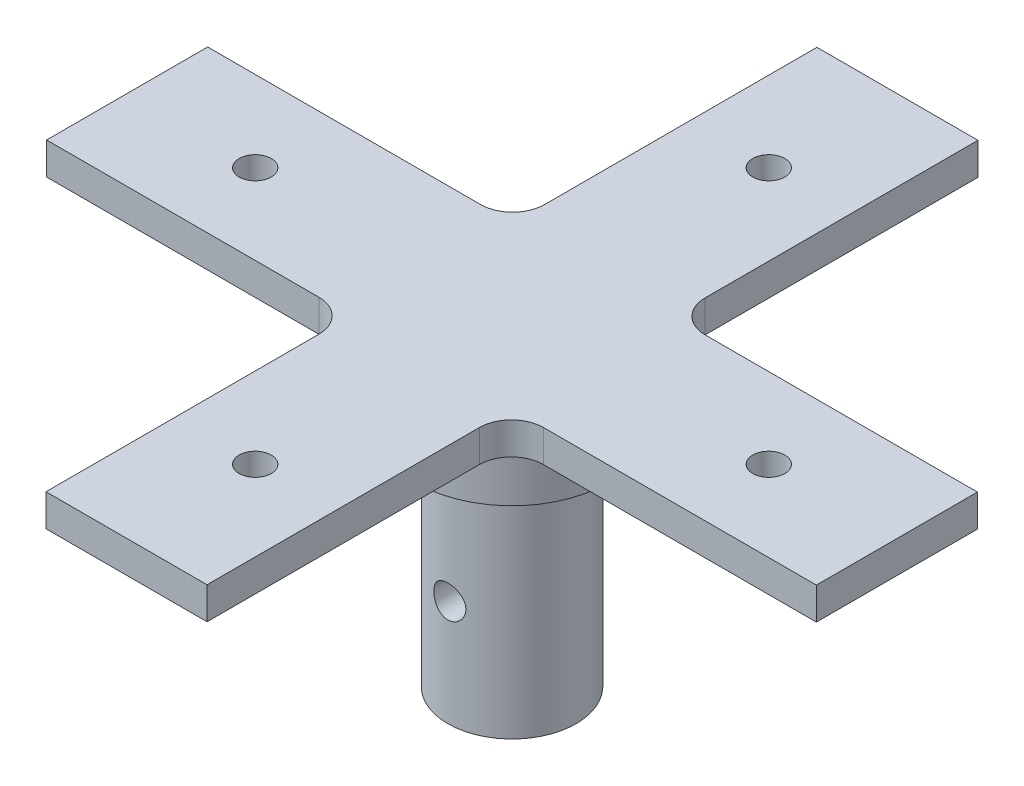
ISO-10303-21;
HEADER;
FILE_DESCRIPTION(('STEP AP214'),'2;1');
FILE_NAME('part.step','',(''),(''),'','','');
FILE_SCHEMA(('AUTOMOTIVE_DESIGN { 1 0 10303 214 1 1 1 1 }'));
ENDSEC;
DATA;
#1=APPLICATION_CONTEXT('core data for automotive mechanical design processes');
#2=APPLICATION_PROTOCOL_DEFINITION('international standard','automotive_design',2000,#1);
#3=PRODUCT_CONTEXT('',#1,'mechanical');
#4=PRODUCT('Part','Part','',(#3));
#5=PRODUCT_RELATED_PRODUCT_CATEGORY('part','',(#4));
#6=PRODUCT_DEFINITION_FORMATION('','',#4);
#7=PRODUCT_DEFINITION_CONTEXT('part definition',#1,'design');
#8=PRODUCT_DEFINITION('design','',#6,#7);
#9=PRODUCT_DEFINITION_SHAPE('','',#8);
#10=(LENGTH_UNIT() NAMED_UNIT(*) SI_UNIT(.MILLI.,.METRE.));
#11=(NAMED_UNIT(*) PLANE_ANGLE_UNIT() SI_UNIT($,.RADIAN.));
#12=(NAMED_UNIT(*) SI_UNIT($,.STERADIAN.) SOLID_ANGLE_UNIT());
#13=UNCERTAINTY_MEASURE_WITH_UNIT(LENGTH_MEASURE(1.E-05),#10,'distance_accuracy_value','');
#14=(GEOMETRIC_REPRESENTATION_CONTEXT(3) GLOBAL_UNCERTAINTY_ASSIGNED_CONTEXT((#13)) GLOBAL_UNIT_ASSIGNED_CONTEXT((#10,
#11,#12)) REPRESENTATION_CONTEXT('',''));
#15=CARTESIAN_POINT('',(0.,0.,0.));
#16=DIRECTION('',(0.,0.,1.));
#17=DIRECTION('',(1.,0.,0.));
#18=AXIS2_PLACEMENT_3D('',#15,#16,#17);
#19=CARTESIAN_POINT('',(0.,35.,0.));
#20=DIRECTION('',(0.,-1.,0.));
#21=DIRECTION('',(0.,0.,-1.));
#22=AXIS2_PLACEMENT_3D('',#19,#20,#21);
#23=CYLINDRICAL_SURFACE('',#22,10.);
#24=CARTESIAN_POINT('',(0.,19.,-10.));
#25=CARTESIAN_POINT('',(-0.138126814449552,18.9999961237697,-9.99999766446687));
#26=CARTESIAN_POINT('',(-0.276296929717938,18.9885140820437,-9.99710963553044));
#27=CARTESIAN_POINT('',(-0.548677206284221,18.942958081155,-9.98586856383157));
#28=CARTESIAN_POINT('',(-0.682885078117899,18.9088713174369,-9.97751242366627));
#29=CARTESIAN_POINT('',(-0.943368120304295,18.8192679108965,-9.9562604388672));
#30=CARTESIAN_POINT('',(-1.06965260571667,18.7637770021412,-9.94337004736764));
#31=CARTESIAN_POINT('',(-1.31112021984071,18.6330310165919,-9.91442239679369));
#32=CARTESIAN_POINT('',(-1.42630297391461,18.5577752731351,-9.89836503090261));
#33=CARTESIAN_POINT('',(-1.64466987883486,18.3879986839097,-9.86445689319489));
#34=CARTESIAN_POINT('',(-1.74759281676843,18.2931473750682,-9.84657845246877));
#35=CARTESIAN_POINT('',(-1.93624821200553,18.0875796584849,-9.8112270019656));
#36=CARTESIAN_POINT('',(-2.02197872824865,17.9768614617551,-9.79375403816446));
#37=CARTESIAN_POINT('',(-2.17504423799829,17.740674622105,-9.76091292830281));
#38=CARTESIAN_POINT('',(-2.2420870265419,17.6150112819855,-9.74557990774685));
#39=CARTESIAN_POINT('',(-2.35399484758457,17.3537526472333,-9.71915824696694));
#40=CARTESIAN_POINT('',(-2.39886342573357,17.2181589444466,-9.70806892824031));
#41=CARTESIAN_POINT('',(-2.46425806134127,16.9437608363306,-9.69167461160538));
#42=CARTESIAN_POINT('',(-2.48525378055342,16.80507517327,-9.68625818328352));
#43=CARTESIAN_POINT('',(-2.50376962511068,16.5260523850011,-9.68148937432652));
#44=CARTESIAN_POINT('',(-2.50129356969685,16.3857155321798,-9.68213600713215));
#45=CARTESIAN_POINT('',(-2.47331087439951,16.1109736537577,-9.68932009194695));
#46=CARTESIAN_POINT('',(-2.44836390031772,15.9765072975578,-9.6957143834549));
#47=CARTESIAN_POINT('',(-2.37704031150498,15.7137315818149,-9.71344516118448));
#48=CARTESIAN_POINT('',(-2.33066217011565,15.5854226616185,-9.72478199948731));
#49=CARTESIAN_POINT('',(-2.21731579656197,15.3371033062465,-9.75125189842765));
#50=CARTESIAN_POINT('',(-2.1501444453882,15.2171897136841,-9.76642212449694));
#51=CARTESIAN_POINT('',(-1.99726046002491,14.9901354837386,-9.79882851409985));
#52=CARTESIAN_POINT('',(-1.91154458134806,14.8829970865546,-9.81606503891047));
#53=CARTESIAN_POINT('',(-1.72110570780203,14.681327307176,-9.85126467566485));
#54=CARTESIAN_POINT('',(-1.61591043027643,14.5872425165644,-9.86923449130002));
#55=CARTESIAN_POINT('',(-1.39101986250616,14.4179645958935,-9.90343275964594));
#56=CARTESIAN_POINT('',(-1.27132412951323,14.3427720428941,-9.91966115915679));
#57=CARTESIAN_POINT('',(-1.02019314780231,14.2132490229594,-9.94862886823651));
#58=CARTESIAN_POINT('',(-0.888718988681034,14.158991099576,-9.96135600212879));
#59=CARTESIAN_POINT('',(-0.618126680238133,14.0734711571507,-9.98179861652361));
#60=CARTESIAN_POINT('',(-0.479009998584136,14.0422047393031,-9.98951505565468));
#61=CARTESIAN_POINT('',(-0.20089995065004,14.0042373907353,-9.99892498785624));
#62=CARTESIAN_POINT('',(-0.061994533313678,13.9969282898745,-10.0007675584713));
#63=CARTESIAN_POINT('',(0.215054791335853,14.0054150034258,-9.99864674690754));
#64=CARTESIAN_POINT('',(0.353198766074332,14.0212087379986,-9.99468388736421));
#65=CARTESIAN_POINT('',(0.622690447960822,14.0749515139856,-9.98149301878918));
#66=CARTESIAN_POINT('',(0.754108531614588,14.1125687724616,-9.97234390309647));
#67=CARTESIAN_POINT('',(1.00876215408753,14.2085118067141,-9.94981177723595));
#68=CARTESIAN_POINT('',(1.13199686505442,14.2668396738554,-9.93642833949965));
#69=CARTESIAN_POINT('',(1.36920522404972,14.4037268814578,-9.9065551321037));
#70=CARTESIAN_POINT('',(1.48297573639295,14.4826268539943,-9.89001445610999));
#71=CARTESIAN_POINT('',(1.69587768940552,14.6579831813286,-9.85574181979587));
#72=CARTESIAN_POINT('',(1.79500659828875,14.7544425660294,-9.83800965421578));
#73=CARTESIAN_POINT('',(1.97831761345414,14.9650032680729,-9.80281594932498));
#74=CARTESIAN_POINT('',(2.06207311270184,15.0794795049993,-9.78537173637463));
#75=CARTESIAN_POINT('',(2.20918459835605,15.3212210574476,-9.75321463970069));
#76=CARTESIAN_POINT('',(2.27254149026901,15.4484858049507,-9.73850163474941));
#77=CARTESIAN_POINT('',(2.37658570101224,15.7115095373437,-9.71363491194665));
#78=CARTESIAN_POINT('',(2.41740732773931,15.8472127138538,-9.70345425375809));
#79=CARTESIAN_POINT('',(2.47557609990489,16.1238493964255,-9.68877906706585));
#80=CARTESIAN_POINT('',(2.49292837912652,16.2647817517024,-9.68428329504044));
#81=CARTESIAN_POINT('',(2.50339765056083,16.5435350397694,-9.68158168701612));
#82=CARTESIAN_POINT('',(2.49719649630132,16.6813290585441,-9.68319887888034));
#83=CARTESIAN_POINT('',(2.46229546385366,16.9538398144438,-9.69213181672143));
#84=CARTESIAN_POINT('',(2.43359603781098,17.0885566133553,-9.69944744817732));
#85=CARTESIAN_POINT('',(2.35488553240495,17.3503474317764,-9.71885434473222));
#86=CARTESIAN_POINT('',(2.30500234113404,17.4774621754006,-9.73091692061057));
#87=CARTESIAN_POINT('',(2.18544152267504,17.7216089711893,-9.7584625954084));
#88=CARTESIAN_POINT('',(2.11576115005696,17.8386396219781,-9.77394616867808));
#89=CARTESIAN_POINT('',(1.95644624772859,18.0625910483368,-9.80709390439337));
#90=CARTESIAN_POINT('',(1.86633860485377,18.1691684557066,-9.82480441386302));
#91=CARTESIAN_POINT('',(1.66964895198289,18.3659117413257,-9.86013378743769));
#92=CARTESIAN_POINT('',(1.56306303543524,18.4560737168549,-9.87775262878422));
#93=CARTESIAN_POINT('',(1.33411264450432,18.6190188476077,-9.9112942607945));
#94=CARTESIAN_POINT('',(1.21149737052731,18.6914576894526,-9.92718055609783));
#95=CARTESIAN_POINT('',(0.955443432517459,18.8145791049009,-9.95508208291861));
#96=CARTESIAN_POINT('',(0.822012605727897,18.8652772677476,-9.96710008666301));
#97=CARTESIAN_POINT('',(0.574017088739116,18.9359530505494,-9.98413432609236));
#98=CARTESIAN_POINT('',(0.460633618180111,18.9599187384224,-9.99004308421151));
#99=CARTESIAN_POINT('',(0.231510119227137,18.9919432393699,-9.9979767538658));
#100=CARTESIAN_POINT('',(0.115770268737693,19.0000032488422,-10.0000019575149));
#101=CARTESIAN_POINT('',(0.,19.,-10.));
#102=B_SPLINE_CURVE_WITH_KNOTS('',3,(#24,#25,#26,#27,#28,#29,#30,#31,#32,#33,#34,#35,#36,#37,
#38,#39,#40,#41,#42,#43,#44,#45,#46,#47,#48,#49,#50,#51,#52,#53,#54,#55,#56,#57,#58,#59,#60,#61,
#62,#63,#64,#65,#66,#67,#68,#69,#70,#71,#72,#73,#74,#75,#76,#77,#78,#79,#80,#81,#82,#83,#84,#85,
#86,#87,#88,#89,#90,#91,#92,#93,#94,#95,#96,#97,#98,#99,#100,#101),.UNSPECIFIED.,.T.,.F.,(4,2,2,
2,2,2,2,2,2,2,2,2,2,2,2,2,2,2,2,2,2,2,2,2,2,2,2,2,2,2,2,2,2,2,2,2,2,2,4),(0.,0.41395618745315,
0.828147062939832,1.24184150381018,1.65554990028221,2.07690725728565,2.4983121596677,
2.92597745909678,3.35357435282281,3.77260491835117,4.19156730193363,4.60037495017232,
5.00921172448932,5.42217546462,5.83521151399139,6.26002501620567,6.6848514926928,
7.11113715020725,7.53734122819939,7.95263848254328,8.36789835193439,8.7770045752893,
9.18615212209352,9.60255979281121,10.0190393835223,10.4457418201299,10.8724253125471,
11.2965375769764,11.7205570543048,12.1323963400749,12.5442273493652,12.9536066760888,
13.3630428023797,13.7831596069298,14.2033761629383,14.6312030917578,15.0587227304538,
15.4057040491338,15.752659267482),.UNSPECIFIED.);
#103=CARTESIAN_POINT('',(0.,19.,-10.));
#104=VERTEX_POINT('',#103);
#105=EDGE_CURVE('E37',#104,#104,#102,.T.);
#106=ORIENTED_EDGE('',*,*,#105,.T.);
#107=EDGE_LOOP('',(#106));
#108=FACE_BOUND('',#107,.T.);
#109=CARTESIAN_POINT('',(2.5,16.5,9.68245836551854));
#110=CARTESIAN_POINT('',(2.49999607859307,16.3619492490734,9.6824610008786));
#111=CARTESIAN_POINT('',(2.48852624549765,16.2238551013215,9.68544306014597));
#112=CARTESIAN_POINT('',(2.44302312546379,15.9516324218265,9.69701861992564));
#113=CARTESIAN_POINT('',(2.40897670674211,15.8175062455318,9.7056153862163));
#114=CARTESIAN_POINT('',(2.31949119963204,15.5571964618128,9.7273872459615));
#115=CARTESIAN_POINT('',(2.26407972785449,15.4310028446143,9.74055642690458));
#116=CARTESIAN_POINT('',(2.13352114126138,15.1896891474601,9.76998192028759));
#117=CARTESIAN_POINT('',(2.05837318856069,15.0745695379198,9.78623836378489));
#118=CARTESIAN_POINT('',(1.88870842731188,14.8561383547378,9.82040716355625));
#119=CARTESIAN_POINT('',(1.79383688770405,14.75310639965,9.83834597623034));
#120=CARTESIAN_POINT('',(1.58818206410066,14.5642386056397,9.87362875515294));
#121=CARTESIAN_POINT('',(1.47739729418031,14.4784043743783,9.89097266566388));
#122=CARTESIAN_POINT('',(1.24114520107896,14.3252245323687,9.92340415520582));
#123=CARTESIAN_POINT('',(1.11549457619512,14.2581536118385,9.93845687400592));
#124=CARTESIAN_POINT('',(0.854263184292764,14.1461903558469,9.96430811925984));
#125=CARTESIAN_POINT('',(0.718683885791942,14.1012947480845,9.97510727334345));
#126=CARTESIAN_POINT('',(0.444358758754164,14.0358521654214,9.9910475884818));
#127=CARTESIAN_POINT('',(0.305732719548978,14.0148303556734,9.99629893844314));
#128=CARTESIAN_POINT('',(0.0268288192627715,13.9962416207245,10.000935941073));
#129=CARTESIAN_POINT('',(-0.113448794538066,13.9986712277904,10.000322460967));
#130=CARTESIAN_POINT('',(-0.388380617930966,14.0265748502501,9.99338094953534));
#131=CARTESIAN_POINT('',(-0.523090539002665,14.0515363250539,9.98718002340871));
#132=CARTESIAN_POINT('',(-0.786345618534213,14.1229712700485,9.96990836524857));
#133=CARTESIAN_POINT('',(-0.914890448426093,14.1694458853774,9.95883737398452));
#134=CARTESIAN_POINT('',(-1.16351675875451,14.2830025706871,9.93287509700884));
#135=CARTESIAN_POINT('',(-1.28351127441626,14.3502670446617,9.91795019695011));
#136=CARTESIAN_POINT('',(-1.51068905585122,14.5033556791163,9.88589903809692));
#137=CARTESIAN_POINT('',(-1.61787008771376,14.5891830685606,9.8687723965265));
#138=CARTESIAN_POINT('',(-1.81943508771239,14.7797087419824,9.83363713769356));
#139=CARTESIAN_POINT('',(-1.91339419768799,14.8848548923477,9.81561719525297));
#140=CARTESIAN_POINT('',(-2.08244093990755,15.1095999735403,9.78115043517327));
#141=CARTESIAN_POINT('',(-2.15752769011507,15.2291995794911,9.76470369108289));
#142=CARTESIAN_POINT('',(-2.28697032255646,15.4802900341489,9.73520496829319));
#143=CARTESIAN_POINT('',(-2.34122391742612,15.6118357303128,9.72216983717007));
#144=CARTESIAN_POINT('',(-2.42671405159095,15.8825854680768,9.70118640148669));
#145=CARTESIAN_POINT('',(-2.45795551638266,16.0217878639846,9.69323700842732));
#146=CARTESIAN_POINT('',(-2.49582963866592,16.2999595015299,9.68355356007457));
#147=CARTESIAN_POINT('',(-2.50309047391912,16.438837793341,9.68166088976934));
#148=CARTESIAN_POINT('',(-2.49451699051516,16.7158219365853,9.68387343364692));
#149=CARTESIAN_POINT('',(-2.4786847978498,16.8539278579494,9.687978095703));
#150=CARTESIAN_POINT('',(-2.42492546393825,17.1231142649486,9.7015708198498));
#151=CARTESIAN_POINT('',(-2.3873640682819,17.2542727265692,9.71096970242532));
#152=CARTESIAN_POINT('',(-2.29161808167046,17.5084314578533,9.73400718262805));
#153=CARTESIAN_POINT('',(-2.2334310477125,17.6314307590558,9.74764628246408));
#154=CARTESIAN_POINT('',(-2.0967706679366,17.8684412778669,9.77796137095511));
#155=CARTESIAN_POINT('',(-2.01792175383564,17.982228840043,9.79469168607245));
#156=CARTESIAN_POINT('',(-1.84265073233613,18.1951883628015,9.82917083071113));
#157=CARTESIAN_POINT('',(-1.74622573701359,18.2943579166501,9.84691982728307));
#158=CARTESIAN_POINT('',(-1.53565680246182,18.4778110425709,9.88197403031774));
#159=CARTESIAN_POINT('',(-1.42112988132898,18.5616600625488,9.8992570206188));
#160=CARTESIAN_POINT('',(-1.17925670673669,18.7089358669513,9.93097216613689));
#161=CARTESIAN_POINT('',(-1.05191112239397,18.7723637166082,9.94540447003949));
#162=CARTESIAN_POINT('',(-0.788895504327724,18.8764460345279,9.96970115738325));
#163=CARTESIAN_POINT('',(-0.653293452569703,18.9172642843791,9.97959830022409));
#164=CARTESIAN_POINT('',(-0.376874400797016,18.9754603346084,9.99385293395789));
#165=CARTESIAN_POINT('',(-0.236058412603099,18.992842658739,9.99821149393422));
#166=CARTESIAN_POINT('',(0.0427088161083098,19.0034189739388,10.0008542352202));
#167=CARTESIAN_POINT('',(0.180634567415056,18.9972542727385,9.99929947199971));
#168=CARTESIAN_POINT('',(0.453418741036879,18.9623804317641,9.99064741143608));
#169=CARTESIAN_POINT('',(0.588277254452324,18.9336719624671,9.98355027892922));
#170=CARTESIAN_POINT('',(0.850427589111937,18.8548694505729,9.96463582134723));
#171=CARTESIAN_POINT('',(0.977756236452158,18.8048913667141,9.95284411255981));
#172=CARTESIAN_POINT('',(1.22229263260406,18.6850735524511,9.92578222284145));
#173=CARTESIAN_POINT('',(1.33949910316409,18.6152313183238,9.91051160346894));
#174=CARTESIAN_POINT('',(1.56350482105826,18.4557119150097,9.87768124200718));
#175=CARTESIAN_POINT('',(1.66998747074584,18.3655996427404,9.86007542354161));
#176=CARTESIAN_POINT('',(1.86653755068376,18.1689428700566,9.82476622642974));
#177=CARTESIAN_POINT('',(1.95660081269148,18.0623942097221,9.80706282418256));
#178=CARTESIAN_POINT('',(2.11940506617958,17.8334964645264,9.77318689613756));
#179=CARTESIAN_POINT('',(2.19179154854095,17.7108896915869,9.75704909183222));
#180=CARTESIAN_POINT('',(2.31481724146368,17.454861275313,9.7285988873707));
#181=CARTESIAN_POINT('',(2.36547227438038,17.3214475847654,9.71628370583034));
#182=CARTESIAN_POINT('',(2.43605632142751,17.0735574704121,9.69879771876843));
#183=CARTESIAN_POINT('',(2.4599829264922,16.9602670890347,9.69271657508747));
#184=CARTESIAN_POINT('',(2.49195573142942,16.7313278275058,9.6845459645655));
#185=CARTESIAN_POINT('',(2.50000328592938,16.615679149389,9.6824561572277));
#186=CARTESIAN_POINT('',(2.5,16.5,9.68245836551854));
#187=B_SPLINE_CURVE_WITH_KNOTS('',3,(#109,#110,#111,#112,#113,#114,#115,#116,#117,#118,#119,
#120,#121,#122,#123,#124,#125,#126,#127,#128,#129,#130,#131,#132,#133,#134,#135,#136,#137,#138,
#139,#140,#141,#142,#143,#144,#145,#146,#147,#148,#149,#150,#151,#152,#153,#154,#155,#156,#157,
#158,#159,#160,#161,#162,#163,#164,#165,#166,#167,#168,#169,#170,#171,#172,#173,#174,#175,#176,
#177,#178,#179,#180,#181,#182,#183,#184,#185,#186),.UNSPECIFIED.,.T.,.F.,(4,2,2,2,2,2,2,2,2,2,2,
2,2,2,2,2,2,2,2,2,2,2,2,2,2,2,2,2,2,2,2,2,2,2,2,2,2,2,4),(0.,0.413727441736139,
0.827695741428666,1.24113072716603,1.65458326755479,2.07623954192976,2.49793521479867,
2.9255149639792,3.35303159847092,3.77188750995347,4.19068148666021,4.60018262688947,
5.00970556724786,5.42292874254445,5.83622385468913,6.26070466571912,6.68520531199802,
7.11176432008403,7.53823200129548,7.95343574764204,8.36860127188747,8.77697405014152,
9.18539521426363,9.60182845864102,10.0183301888999,10.4452533097026,10.872154157245,
11.2959207281187,11.7196054891398,12.131834461324,12.5440511738193,12.9540487656466,
13.3640980574302,13.7839709658702,14.2039503157045,14.6317647729113,15.0592672137501,
15.4059782718572,15.7526597510792),.UNSPECIFIED.);
#188=CARTESIAN_POINT('',(2.5,16.5,9.68245836551854));
#189=VERTEX_POINT('',#188);
#190=EDGE_CURVE('E262',#189,#189,#187,.T.);
#191=ORIENTED_EDGE('',*,*,#190,.T.);
#192=EDGE_LOOP('',(#191));
#193=FACE_BOUND('',#192,.T.);
#194=CARTESIAN_POINT('',(0.,35.,0.));
#195=DIRECTION('',(0.,1.,0.));
#196=DIRECTION('',(0.,0.,1.));
#197=AXIS2_PLACEMENT_3D('',#194,#195,#196);
#198=CIRCLE('',#197,10.);
#199=CARTESIAN_POINT('',(0.,35.,10.));
#200=VERTEX_POINT('',#199);
#201=EDGE_CURVE('E11',#200,#200,#198,.T.);
#202=ORIENTED_EDGE('',*,*,#201,.F.);
#203=EDGE_LOOP('',(#202));
#204=FACE_BOUND('',#203,.T.);
#205=CARTESIAN_POINT('',(0.,0.,0.));
#206=DIRECTION('',(0.,1.,0.));
#207=DIRECTION('',(0.,0.,1.));
#208=AXIS2_PLACEMENT_3D('',#205,#206,#207);
#209=CIRCLE('',#208,10.);
#210=CARTESIAN_POINT('',(0.,0.,10.));
#211=VERTEX_POINT('',#210);
#212=EDGE_CURVE('E46',#211,#211,#209,.T.);
#213=ORIENTED_EDGE('',*,*,#212,.T.);
#214=EDGE_LOOP('',(#213));
#215=FACE_BOUND('',#214,.T.);
#216=ADVANCED_FACE('F33',(#108,#193,#204,#215),#23,.T.);
#217=CARTESIAN_POINT('',(0.,0.,0.));
#218=DIRECTION('',(0.,1.,0.));
#219=DIRECTION('',(0.,0.,1.));
#220=AXIS2_PLACEMENT_3D('',#217,#218,#219);
#221=PLANE('',#220);
#222=ORIENTED_EDGE('',*,*,#212,.F.);
#223=EDGE_LOOP('',(#222));
#224=FACE_BOUND('',#223,.T.);
#225=ADVANCED_FACE('F357',(#224),#221,.F.);
#226=CARTESIAN_POINT('',(0.,35.,0.));
#227=DIRECTION('',(0.,1.,0.));
#228=DIRECTION('',(0.,0.,1.));
#229=AXIS2_PLACEMENT_3D('',#226,#227,#228);
#230=PLANE('',#229);
#231=CARTESIAN_POINT('',(0.,35.,0.));
#232=DIRECTION('',(0.,1.,0.));
#233=DIRECTION('',(0.,0.,1.));
#234=AXIS2_PLACEMENT_3D('',#231,#232,#233);
#235=CIRCLE('',#234,15.);
#236=CARTESIAN_POINT('',(0.,35.,15.));
#237=VERTEX_POINT('',#236);
#238=EDGE_CURVE('E255',#237,#237,#235,.T.);
#239=ORIENTED_EDGE('',*,*,#238,.F.);
#240=EDGE_LOOP('',(#239));
#241=FACE_BOUND('',#240,.T.);
#242=ORIENTED_EDGE('',*,*,#201,.T.);
#243=EDGE_LOOP('',(#242));
#244=FACE_BOUND('',#243,.T.);
#245=ADVANCED_FACE('F354',(#241,#244),#230,.F.);
#246=CARTESIAN_POINT('',(0.,45.,0.));
#247=DIRECTION('',(0.,-1.,0.));
#248=DIRECTION('',(0.,0.,-1.));
#249=AXIS2_PLACEMENT_3D('',#246,#247,#248);
#250=CYLINDRICAL_SURFACE('',#249,15.);
#251=CARTESIAN_POINT('',(0.,45.,0.));
#252=DIRECTION('',(0.,1.,0.));
#253=DIRECTION('',(0.,0.,1.));
#254=AXIS2_PLACEMENT_3D('',#251,#252,#253);
#255=CIRCLE('',#254,15.);
#256=CARTESIAN_POINT('',(0.,45.,15.));
#257=VERTEX_POINT('',#256);
#258=EDGE_CURVE('E256',#257,#257,#255,.T.);
#259=ORIENTED_EDGE('',*,*,#258,.F.);
#260=EDGE_LOOP('',(#259));
#261=FACE_BOUND('',#260,.T.);
#262=ORIENTED_EDGE('',*,*,#238,.T.);
#263=EDGE_LOOP('',(#262));
#264=FACE_BOUND('',#263,.T.);
#265=ADVANCED_FACE('F296',(#261,#264),#250,.T.);
#266=CARTESIAN_POINT('',(-17.5880768632219,45.,17.4985035666401));
#267=DIRECTION('',(0.,1.,0.));
#268=DIRECTION('',(0.,0.,1.));
#269=AXIS2_PLACEMENT_3D('',#266,#267,#268);
#270=PLANE('',#269);
#271=CARTESIAN_POINT('',(-40.,45.,-4.17243037185199E-13));
#272=DIRECTION('',(0.,1.,0.));
#273=DIRECTION('',(0.,0.,1.));
#274=AXIS2_PLACEMENT_3D('',#271,#272,#273);
#275=CIRCLE('',#274,2.5);
#276=CARTESIAN_POINT('',(-40.,45.,2.49999999999958));
#277=VERTEX_POINT('',#276);
#278=EDGE_CURVE('E379',#277,#277,#275,.T.);
#279=ORIENTED_EDGE('',*,*,#278,.T.);
#280=EDGE_LOOP('',(#279));
#281=FACE_BOUND('',#280,.T.);
#282=CARTESIAN_POINT('',(40.,45.,1.39659253553725E-13));
#283=DIRECTION('',(0.,1.,0.));
#284=DIRECTION('',(0.,0.,1.));
#285=AXIS2_PLACEMENT_3D('',#282,#283,#284);
#286=CIRCLE('',#285,2.5);
#287=CARTESIAN_POINT('',(40.,45.,2.50000000000014));
#288=VERTEX_POINT('',#287);
#289=EDGE_CURVE('E391',#288,#288,#286,.T.);
#290=ORIENTED_EDGE('',*,*,#289,.T.);
#291=EDGE_LOOP('',(#290));
#292=FACE_BOUND('',#291,.T.);
#293=CARTESIAN_POINT('',(-17.5880768632219,45.,17.4985035666401));
#294=DIRECTION('',(0.,-1.,0.));
#295=DIRECTION('',(0.,0.,1.));
#296=AXIS2_PLACEMENT_3D('',#293,#294,#295);
#297=CIRCLE('',#296,4.99850356664096);
#298=CARTESIAN_POINT('',(-17.5880768632219,45.,12.4999999999994));
#299=VERTEX_POINT('',#298);
#300=CARTESIAN_POINT('',(-12.5895732965807,45.,17.4985035666402));
#301=VERTEX_POINT('',#300);
#302=EDGE_CURVE('E185',#299,#301,#297,.T.);
#303=ORIENTED_EDGE('',*,*,#302,.F.);
#304=DIRECTION('',(1.,0.,0.));
#305=VECTOR('',#304,1.);
#306=CARTESIAN_POINT('',(-60.,45.,12.4999999999994));
#307=LINE('',#306,#305);
#308=CARTESIAN_POINT('',(-60.,45.,12.4999999999994));
#309=VERTEX_POINT('',#308);
#310=EDGE_CURVE('E113',#309,#299,#307,.T.);
#311=ORIENTED_EDGE('',*,*,#310,.F.);
#312=DIRECTION('',(0.,0.,1.));
#313=VECTOR('',#312,1.);
#314=CARTESIAN_POINT('',(-60.,45.,-6.26731917515787E-13));
#315=LINE('',#314,#313);
#316=CARTESIAN_POINT('',(-60.,45.,-12.5895732965805));
#317=VERTEX_POINT('',#316);
#318=EDGE_CURVE('E107',#317,#309,#315,.T.);
#319=ORIENTED_EDGE('',*,*,#318,.F.);
#320=DIRECTION('',(-1.,0.,0.));
#321=VECTOR('',#320,1.);
#322=CARTESIAN_POINT('',(-60.,45.,-12.5895732965805));
#323=LINE('',#322,#321);
#324=CARTESIAN_POINT('',(-17.4985035666401,45.,-12.5895732965808));
#325=VERTEX_POINT('',#324);
#326=EDGE_CURVE('E175',#325,#317,#323,.T.);
#327=ORIENTED_EDGE('',*,*,#326,.F.);
#328=CARTESIAN_POINT('',(-17.49850356664,45.,-17.5880768632219));
#329=DIRECTION('',(0.,-1.,0.));
#330=DIRECTION('',(0.,0.,1.));
#331=AXIS2_PLACEMENT_3D('',#328,#329,#330);
#332=CIRCLE('',#331,4.99850356664095);
#333=CARTESIAN_POINT('',(-12.4999999999991,45.,-17.5880768632219));
#334=VERTEX_POINT('',#333);
#335=EDGE_CURVE('E211',#334,#325,#332,.T.);
#336=ORIENTED_EDGE('',*,*,#335,.F.);
#337=DIRECTION('',(0.,0.,1.));
#338=VECTOR('',#337,1.);
#339=CARTESIAN_POINT('',(-12.4999999999992,45.,-60.));
#340=LINE('',#339,#338);
#341=CARTESIAN_POINT('',(-12.4999999999992,45.,-60.));
#342=VERTEX_POINT('',#341);
#343=EDGE_CURVE('E209',#342,#334,#340,.T.);
#344=ORIENTED_EDGE('',*,*,#343,.F.);
#345=DIRECTION('',(-1.,0.,0.));
#346=VECTOR('',#345,1.);
#347=CARTESIAN_POINT('',(12.5895732965807,45.,-60.));
#348=LINE('',#347,#346);
#349=CARTESIAN_POINT('',(12.5895732965807,45.,-60.));
#350=VERTEX_POINT('',#349);
#351=EDGE_CURVE('E207',#350,#342,#348,.T.);
#352=ORIENTED_EDGE('',*,*,#351,.F.);
#353=DIRECTION('',(0.,0.,-1.));
#354=VECTOR('',#353,1.);
#355=CARTESIAN_POINT('',(12.5895732965807,45.,-60.));
#356=LINE('',#355,#354);
#357=CARTESIAN_POINT('',(12.5895732965808,45.,-17.4985035666401));
#358=VERTEX_POINT('',#357);
#359=EDGE_CURVE('E205',#358,#350,#356,.T.);
#360=ORIENTED_EDGE('',*,*,#359,.F.);
#361=CARTESIAN_POINT('',(17.588076863222,45.,-17.49850356664));
#362=DIRECTION('',(0.,-1.,0.));
#363=DIRECTION('',(0.,0.,1.));
#364=AXIS2_PLACEMENT_3D('',#361,#362,#363);
#365=CIRCLE('',#364,4.99850356664096);
#366=CARTESIAN_POINT('',(17.588076863222,45.,-12.499999999999));
#367=VERTEX_POINT('',#366);
#368=EDGE_CURVE('E203',#367,#358,#365,.T.);
#369=ORIENTED_EDGE('',*,*,#368,.F.);
#370=DIRECTION('',(-1.,0.,0.));
#371=VECTOR('',#370,1.);
#372=CARTESIAN_POINT('',(60.0000000000001,45.,-12.499999999999));
#373=LINE('',#372,#371);
#374=CARTESIAN_POINT('',(60.0000000000001,45.,-12.499999999999));
#375=VERTEX_POINT('',#374);
#376=EDGE_CURVE('E201',#375,#367,#373,.T.);
#377=ORIENTED_EDGE('',*,*,#376,.F.);
#378=DIRECTION('',(0.,0.,-1.));
#379=VECTOR('',#378,1.);
#380=CARTESIAN_POINT('',(59.9999999999999,45.,12.5895732965809));
#381=LINE('',#380,#379);
#382=CARTESIAN_POINT('',(59.9999999999999,45.,12.5895732965809));
#383=VERTEX_POINT('',#382);
#384=EDGE_CURVE('E199',#383,#375,#381,.T.);
#385=ORIENTED_EDGE('',*,*,#384,.F.);
#386=DIRECTION('',(1.,0.,0.));
#387=VECTOR('',#386,1.);
#388=CARTESIAN_POINT('',(59.9999999999999,45.,12.5895732965809));
#389=LINE('',#388,#387);
#390=CARTESIAN_POINT('',(17.49850356664,45.,12.5895732965809));
#391=VERTEX_POINT('',#390);
#392=EDGE_CURVE('E197',#391,#383,#389,.T.);
#393=ORIENTED_EDGE('',*,*,#392,.F.);
#394=CARTESIAN_POINT('',(17.4985035666399,45.,17.5880768632221));
#395=DIRECTION('',(0.,-1.,0.));
#396=DIRECTION('',(0.,0.,1.));
#397=AXIS2_PLACEMENT_3D('',#394,#395,#396);
#398=CIRCLE('',#397,4.99850356664096);
#399=CARTESIAN_POINT('',(12.499999999999,45.,17.588076863222));
#400=VERTEX_POINT('',#399);
#401=EDGE_CURVE('E195',#400,#391,#398,.T.);
#402=ORIENTED_EDGE('',*,*,#401,.F.);
#403=DIRECTION('',(0.,0.,-1.));
#404=VECTOR('',#403,1.);
#405=CARTESIAN_POINT('',(12.4999999999987,45.,60.0000000000001));
#406=LINE('',#405,#404);
#407=CARTESIAN_POINT('',(12.4999999999987,45.,60.0000000000001));
#408=VERTEX_POINT('',#407);
#409=EDGE_CURVE('E193',#408,#400,#406,.T.);
#410=ORIENTED_EDGE('',*,*,#409,.F.);
#411=DIRECTION('',(1.,0.,0.));
#412=VECTOR('',#411,1.);
#413=CARTESIAN_POINT('',(12.4999999999987,45.,60.0000000000001));
#414=LINE('',#413,#412);
#415=CARTESIAN_POINT('',(-12.5895732965811,45.,59.9999999999999));
#416=VERTEX_POINT('',#415);
#417=EDGE_CURVE('E191',#416,#408,#414,.T.);
#418=ORIENTED_EDGE('',*,*,#417,.F.);
#419=DIRECTION('',(0.,0.,1.));
#420=VECTOR('',#419,1.);
#421=CARTESIAN_POINT('',(-12.5895732965811,45.,59.9999999999999));
#422=LINE('',#421,#420);
#423=EDGE_CURVE('E188',#301,#416,#422,.T.);
#424=ORIENTED_EDGE('',*,*,#423,.F.);
#425=EDGE_LOOP('',(#303,#311,#319,#327,#336,#344,#352,#360,#369,#377,#385,#393,#402,#410,#418,#424));
#426=FACE_BOUND('',#425,.T.);
#427=CARTESIAN_POINT('',(0.,45.,-40.));
#428=DIRECTION('',(0.,1.,0.));
#429=DIRECTION('',(0.,0.,1.));
#430=AXIS2_PLACEMENT_3D('',#427,#428,#429);
#431=CIRCLE('',#430,2.5);
#432=CARTESIAN_POINT('',(0.,45.,-37.5));
#433=VERTEX_POINT('',#432);
#434=EDGE_CURVE('E397',#433,#433,#431,.T.);
#435=ORIENTED_EDGE('',*,*,#434,.T.);
#436=EDGE_LOOP('',(#435));
#437=FACE_BOUND('',#436,.T.);
#438=CARTESIAN_POINT('',(-2.79318507107451E-13,45.,40.));
#439=DIRECTION('',(0.,1.,0.));
#440=DIRECTION('',(0.,0.,1.));
#441=AXIS2_PLACEMENT_3D('',#438,#439,#440);
#442=CIRCLE('',#441,2.5);
#443=CARTESIAN_POINT('',(-2.79318507107451E-13,45.,42.5));
#444=VERTEX_POINT('',#443);
#445=EDGE_CURVE('E385',#444,#444,#442,.T.);
#446=ORIENTED_EDGE('',*,*,#445,.T.);
#447=EDGE_LOOP('',(#446));
#448=FACE_BOUND('',#447,.T.);
#449=ORIENTED_EDGE('',*,*,#258,.T.);
#450=EDGE_LOOP('',(#449));
#451=FACE_BOUND('',#450,.T.);
#452=ADVANCED_FACE('F292',(#281,#292,#426,#437,#448,#451),#270,.F.);
#453=CARTESIAN_POINT('',(-17.5880768632219,50.,17.4985035666401));
#454=DIRECTION('',(0.,1.,0.));
#455=DIRECTION('',(0.,0.,1.));
#456=AXIS2_PLACEMENT_3D('',#453,#454,#455);
#457=PLANE('',#456);
#458=CARTESIAN_POINT('',(-2.79318507107451E-13,50.,40.));
#459=DIRECTION('',(0.,1.,0.));
#460=DIRECTION('',(0.,0.,1.));
#461=AXIS2_PLACEMENT_3D('',#458,#459,#460);
#462=CIRCLE('',#461,2.5);
#463=CARTESIAN_POINT('',(-2.79318507107451E-13,50.,42.5));
#464=VERTEX_POINT('',#463);
#465=EDGE_CURVE('E388',#464,#464,#462,.T.);
#466=ORIENTED_EDGE('',*,*,#465,.F.);
#467=EDGE_LOOP('',(#466));
#468=FACE_BOUND('',#467,.T.);
#469=CARTESIAN_POINT('',(0.,50.,-40.));
#470=DIRECTION('',(0.,1.,0.));
#471=DIRECTION('',(0.,0.,1.));
#472=AXIS2_PLACEMENT_3D('',#469,#470,#471);
#473=CIRCLE('',#472,2.5);
#474=CARTESIAN_POINT('',(0.,50.,-37.5));
#475=VERTEX_POINT('',#474);
#476=EDGE_CURVE('E189',#475,#475,#473,.T.);
#477=ORIENTED_EDGE('',*,*,#476,.F.);
#478=EDGE_LOOP('',(#477));
#479=FACE_BOUND('',#478,.T.);
#480=CARTESIAN_POINT('',(-17.5880768632219,50.,17.4985035666401));
#481=DIRECTION('',(0.,-1.,0.));
#482=DIRECTION('',(0.,0.,1.));
#483=AXIS2_PLACEMENT_3D('',#480,#481,#482);
#484=CIRCLE('',#483,4.99850356664096);
#485=CARTESIAN_POINT('',(-17.5880768632219,50.,12.4999999999994));
#486=VERTEX_POINT('',#485);
#487=CARTESIAN_POINT('',(-12.5895732965807,50.,17.4985035666402));
#488=VERTEX_POINT('',#487);
#489=EDGE_CURVE('E216',#486,#488,#484,.T.);
#490=ORIENTED_EDGE('',*,*,#489,.T.);
#491=DIRECTION('',(0.,0.,1.));
#492=VECTOR('',#491,1.);
#493=CARTESIAN_POINT('',(-12.5895732965811,50.,59.9999999999999));
#494=LINE('',#493,#492);
#495=CARTESIAN_POINT('',(-12.5895732965811,50.,59.9999999999999));
#496=VERTEX_POINT('',#495);
#497=EDGE_CURVE('E122',#488,#496,#494,.T.);
#498=ORIENTED_EDGE('',*,*,#497,.T.);
#499=DIRECTION('',(1.,0.,0.));
#500=VECTOR('',#499,1.);
#501=CARTESIAN_POINT('',(12.4999999999987,50.,60.0000000000001));
#502=LINE('',#501,#500);
#503=CARTESIAN_POINT('',(12.4999999999987,50.,60.0000000000001));
#504=VERTEX_POINT('',#503);
#505=EDGE_CURVE('E406',#496,#504,#502,.T.);
#506=ORIENTED_EDGE('',*,*,#505,.T.);
#507=DIRECTION('',(0.,0.,-1.));
#508=VECTOR('',#507,1.);
#509=CARTESIAN_POINT('',(12.4999999999987,50.,60.0000000000001));
#510=LINE('',#509,#508);
#511=CARTESIAN_POINT('',(12.499999999999,50.,17.588076863222));
#512=VERTEX_POINT('',#511);
#513=EDGE_CURVE('E408',#504,#512,#510,.T.);
#514=ORIENTED_EDGE('',*,*,#513,.T.);
#515=CARTESIAN_POINT('',(17.4985035666399,50.,17.5880768632221));
#516=DIRECTION('',(0.,-1.,0.));
#517=DIRECTION('',(0.,0.,1.));
#518=AXIS2_PLACEMENT_3D('',#515,#516,#517);
#519=CIRCLE('',#518,4.99850356664096);
#520=CARTESIAN_POINT('',(17.49850356664,50.,12.5895732965809));
#521=VERTEX_POINT('',#520);
#522=EDGE_CURVE('E410',#512,#521,#519,.T.);
#523=ORIENTED_EDGE('',*,*,#522,.T.);
#524=DIRECTION('',(1.,0.,0.));
#525=VECTOR('',#524,1.);
#526=CARTESIAN_POINT('',(59.9999999999999,50.,12.5895732965809));
#527=LINE('',#526,#525);
#528=CARTESIAN_POINT('',(59.9999999999999,50.,12.5895732965809));
#529=VERTEX_POINT('',#528);
#530=EDGE_CURVE('E412',#521,#529,#527,.T.);
#531=ORIENTED_EDGE('',*,*,#530,.T.);
#532=DIRECTION('',(0.,0.,-1.));
#533=VECTOR('',#532,1.);
#534=CARTESIAN_POINT('',(59.9999999999999,50.,12.5895732965809));
#535=LINE('',#534,#533);
#536=CARTESIAN_POINT('',(60.0000000000001,50.,-12.499999999999));
#537=VERTEX_POINT('',#536);
#538=EDGE_CURVE('E414',#529,#537,#535,.T.);
#539=ORIENTED_EDGE('',*,*,#538,.T.);
#540=DIRECTION('',(-1.,0.,0.));
#541=VECTOR('',#540,1.);
#542=CARTESIAN_POINT('',(60.0000000000001,50.,-12.499999999999));
#543=LINE('',#542,#541);
#544=CARTESIAN_POINT('',(17.588076863222,50.,-12.499999999999));
#545=VERTEX_POINT('',#544);
#546=EDGE_CURVE('E416',#537,#545,#543,.T.);
#547=ORIENTED_EDGE('',*,*,#546,.T.);
#548=CARTESIAN_POINT('',(17.588076863222,50.,-17.49850356664));
#549=DIRECTION('',(0.,-1.,0.));
#550=DIRECTION('',(0.,0.,1.));
#551=AXIS2_PLACEMENT_3D('',#548,#549,#550);
#552=CIRCLE('',#551,4.99850356664096);
#553=CARTESIAN_POINT('',(12.5895732965808,50.,-17.4985035666401));
#554=VERTEX_POINT('',#553);
#555=EDGE_CURVE('E418',#545,#554,#552,.T.);
#556=ORIENTED_EDGE('',*,*,#555,.T.);
#557=DIRECTION('',(0.,0.,-1.));
#558=VECTOR('',#557,1.);
#559=CARTESIAN_POINT('',(12.5895732965807,50.,-60.));
#560=LINE('',#559,#558);
#561=CARTESIAN_POINT('',(12.5895732965807,50.,-60.));
#562=VERTEX_POINT('',#561);
#563=EDGE_CURVE('E420',#554,#562,#560,.T.);
#564=ORIENTED_EDGE('',*,*,#563,.T.);
#565=DIRECTION('',(-1.,0.,0.));
#566=VECTOR('',#565,1.);
#567=CARTESIAN_POINT('',(12.5895732965807,50.,-60.));
#568=LINE('',#567,#566);
#569=CARTESIAN_POINT('',(-12.4999999999992,50.,-60.));
#570=VERTEX_POINT('',#569);
#571=EDGE_CURVE('E422',#562,#570,#568,.T.);
#572=ORIENTED_EDGE('',*,*,#571,.T.);
#573=DIRECTION('',(0.,0.,1.));
#574=VECTOR('',#573,1.);
#575=CARTESIAN_POINT('',(-12.4999999999992,50.,-60.));
#576=LINE('',#575,#574);
#577=CARTESIAN_POINT('',(-12.4999999999991,50.,-17.5880768632219));
#578=VERTEX_POINT('',#577);
#579=EDGE_CURVE('E424',#570,#578,#576,.T.);
#580=ORIENTED_EDGE('',*,*,#579,.T.);
#581=CARTESIAN_POINT('',(-17.49850356664,50.,-17.5880768632219));
#582=DIRECTION('',(0.,-1.,0.));
#583=DIRECTION('',(0.,0.,1.));
#584=AXIS2_PLACEMENT_3D('',#581,#582,#583);
#585=CIRCLE('',#584,4.99850356664095);
#586=CARTESIAN_POINT('',(-17.4985035666401,50.,-12.5895732965808));
#587=VERTEX_POINT('',#586);
#588=EDGE_CURVE('E166',#578,#587,#585,.T.);
#589=ORIENTED_EDGE('',*,*,#588,.T.);
#590=DIRECTION('',(-1.,0.,0.));
#591=VECTOR('',#590,1.);
#592=CARTESIAN_POINT('',(-60.,50.,-12.5895732965805));
#593=LINE('',#592,#591);
#594=CARTESIAN_POINT('',(-60.,50.,-12.5895732965805));
#595=VERTEX_POINT('',#594);
#596=EDGE_CURVE('E159',#587,#595,#593,.T.);
#597=ORIENTED_EDGE('',*,*,#596,.T.);
#598=DIRECTION('',(0.,0.,1.));
#599=VECTOR('',#598,1.);
#600=CARTESIAN_POINT('',(-60.,50.,-6.26731917515787E-13));
#601=LINE('',#600,#599);
#602=CARTESIAN_POINT('',(-60.,50.,12.4999999999994));
#603=VERTEX_POINT('',#602);
#604=EDGE_CURVE('E164',#595,#603,#601,.T.);
#605=ORIENTED_EDGE('',*,*,#604,.T.);
#606=DIRECTION('',(1.,0.,0.));
#607=VECTOR('',#606,1.);
#608=CARTESIAN_POINT('',(-60.,50.,12.4999999999994));
#609=LINE('',#608,#607);
#610=EDGE_CURVE('E55',#603,#486,#609,.T.);
#611=ORIENTED_EDGE('',*,*,#610,.T.);
#612=EDGE_LOOP('',(#490,#498,#506,#514,#523,#531,#539,#547,#556,#564,#572,#580,#589,#597,#605,#611));
#613=FACE_BOUND('',#612,.T.);
#614=CARTESIAN_POINT('',(40.,50.,1.39659253553725E-13));
#615=DIRECTION('',(0.,1.,0.));
#616=DIRECTION('',(0.,0.,1.));
#617=AXIS2_PLACEMENT_3D('',#614,#615,#616);
#618=CIRCLE('',#617,2.5);
#619=CARTESIAN_POINT('',(40.,50.,2.50000000000014));
#620=VERTEX_POINT('',#619);
#621=EDGE_CURVE('E394',#620,#620,#618,.T.);
#622=ORIENTED_EDGE('',*,*,#621,.F.);
#623=EDGE_LOOP('',(#622));
#624=FACE_BOUND('',#623,.T.);
#625=CARTESIAN_POINT('',(-40.,50.,-4.17243037185199E-13));
#626=DIRECTION('',(0.,1.,0.));
#627=DIRECTION('',(0.,0.,1.));
#628=AXIS2_PLACEMENT_3D('',#625,#626,#627);
#629=CIRCLE('',#628,2.5);
#630=CARTESIAN_POINT('',(-40.,50.,2.49999999999958));
#631=VERTEX_POINT('',#630);
#632=EDGE_CURVE('E381',#631,#631,#629,.T.);
#633=ORIENTED_EDGE('',*,*,#632,.F.);
#634=EDGE_LOOP('',(#633));
#635=FACE_BOUND('',#634,.T.);
#636=ADVANCED_FACE('F161',(#468,#479,#613,#624,#635),#457,.T.);
#637=CARTESIAN_POINT('',(-17.5880768632219,50.,17.4985035666401));
#638=DIRECTION('',(0.,-1.,0.));
#639=DIRECTION('',(0.,0.,-1.));
#640=AXIS2_PLACEMENT_3D('',#637,#638,#639);
#641=CYLINDRICAL_SURFACE('',#640,4.99850356664096);
#642=ORIENTED_EDGE('',*,*,#302,.T.);
#643=DIRECTION('',(0.,-1.,0.));
#644=VECTOR('',#643,1.);
#645=CARTESIAN_POINT('',(-12.5895732965807,50.,17.4985035666402));
#646=LINE('',#645,#644);
#647=EDGE_CURVE('E253',#488,#301,#646,.T.);
#648=ORIENTED_EDGE('',*,*,#647,.F.);
#649=ORIENTED_EDGE('',*,*,#489,.F.);
#650=DIRECTION('',(0.,-1.,0.));
#651=VECTOR('',#650,1.);
#652=CARTESIAN_POINT('',(-17.5880768632219,50.,12.4999999999994));
#653=LINE('',#652,#651);
#654=EDGE_CURVE('E181',#486,#299,#653,.T.);
#655=ORIENTED_EDGE('',*,*,#654,.T.);
#656=EDGE_LOOP('',(#642,#648,#649,#655));
#657=FACE_BOUND('',#656,.T.);
#658=ADVANCED_FACE('F291',(#657),#641,.F.);
#659=CARTESIAN_POINT('',(-12.5895732965811,50.,59.9999999999999));
#660=DIRECTION('',(1.,0.,0.));
#661=DIRECTION('',(0.,0.,-1.));
#662=AXIS2_PLACEMENT_3D('',#659,#660,#661);
#663=PLANE('',#662);
#664=ORIENTED_EDGE('',*,*,#423,.T.);
#665=DIRECTION('',(0.,-1.,0.));
#666=VECTOR('',#665,1.);
#667=CARTESIAN_POINT('',(-12.5895732965811,50.,59.9999999999999));
#668=LINE('',#667,#666);
#669=EDGE_CURVE('E250',#496,#416,#668,.T.);
#670=ORIENTED_EDGE('',*,*,#669,.F.);
#671=ORIENTED_EDGE('',*,*,#497,.F.);
#672=ORIENTED_EDGE('',*,*,#647,.T.);
#673=EDGE_LOOP('',(#664,#670,#671,#672));
#674=FACE_BOUND('',#673,.T.);
#675=ADVANCED_FACE('F347',(#674),#663,.F.);
#676=CARTESIAN_POINT('',(12.4999999999987,50.,60.0000000000001));
#677=DIRECTION('',(0.,0.,-1.));
#678=DIRECTION('',(-1.,0.,0.));
#679=AXIS2_PLACEMENT_3D('',#676,#677,#678);
#680=PLANE('',#679);
#681=ORIENTED_EDGE('',*,*,#417,.T.);
#682=DIRECTION('',(0.,-1.,0.));
#683=VECTOR('',#682,1.);
#684=CARTESIAN_POINT('',(12.4999999999987,50.,60.0000000000001));
#685=LINE('',#684,#683);
#686=EDGE_CURVE('E247',#504,#408,#685,.T.);
#687=ORIENTED_EDGE('',*,*,#686,.F.);
#688=ORIENTED_EDGE('',*,*,#505,.F.);
#689=ORIENTED_EDGE('',*,*,#669,.T.);
#690=EDGE_LOOP('',(#681,#687,#688,#689));
#691=FACE_BOUND('',#690,.T.);
#692=ADVANCED_FACE('F343',(#691),#680,.F.);
#693=CARTESIAN_POINT('',(12.4999999999987,50.,60.0000000000001));
#694=DIRECTION('',(-1.,0.,0.));
#695=DIRECTION('',(0.,0.,1.));
#696=AXIS2_PLACEMENT_3D('',#693,#694,#695);
#697=PLANE('',#696);
#698=ORIENTED_EDGE('',*,*,#409,.T.);
#699=DIRECTION('',(0.,-1.,0.));
#700=VECTOR('',#699,1.);
#701=CARTESIAN_POINT('',(12.499999999999,50.,17.588076863222));
#702=LINE('',#701,#700);
#703=EDGE_CURVE('E244',#512,#400,#702,.T.);
#704=ORIENTED_EDGE('',*,*,#703,.F.);
#705=ORIENTED_EDGE('',*,*,#513,.F.);
#706=ORIENTED_EDGE('',*,*,#686,.T.);
#707=EDGE_LOOP('',(#698,#704,#705,#706));
#708=FACE_BOUND('',#707,.T.);
#709=ADVANCED_FACE('F339',(#708),#697,.F.);
#710=CARTESIAN_POINT('',(17.4985035666399,50.,17.5880768632221));
#711=DIRECTION('',(0.,-1.,0.));
#712=DIRECTION('',(0.,0.,-1.));
#713=AXIS2_PLACEMENT_3D('',#710,#711,#712);
#714=CYLINDRICAL_SURFACE('',#713,4.99850356664096);
#715=ORIENTED_EDGE('',*,*,#401,.T.);
#716=DIRECTION('',(0.,-1.,0.));
#717=VECTOR('',#716,1.);
#718=CARTESIAN_POINT('',(17.49850356664,50.,12.5895732965809));
#719=LINE('',#718,#717);
#720=EDGE_CURVE('E241',#521,#391,#719,.T.);
#721=ORIENTED_EDGE('',*,*,#720,.F.);
#722=ORIENTED_EDGE('',*,*,#522,.F.);
#723=ORIENTED_EDGE('',*,*,#703,.T.);
#724=EDGE_LOOP('',(#715,#721,#722,#723));
#725=FACE_BOUND('',#724,.T.);
#726=ADVANCED_FACE('F335',(#725),#714,.F.);
#727=CARTESIAN_POINT('',(59.9999999999999,50.,12.5895732965809));
#728=DIRECTION('',(0.,0.,-1.));
#729=DIRECTION('',(-1.,0.,0.));
#730=AXIS2_PLACEMENT_3D('',#727,#728,#729);
#731=PLANE('',#730);
#732=ORIENTED_EDGE('',*,*,#392,.T.);
#733=DIRECTION('',(0.,-1.,0.));
#734=VECTOR('',#733,1.);
#735=CARTESIAN_POINT('',(59.9999999999999,50.,12.5895732965809));
#736=LINE('',#735,#734);
#737=EDGE_CURVE('E238',#529,#383,#736,.T.);
#738=ORIENTED_EDGE('',*,*,#737,.F.);
#739=ORIENTED_EDGE('',*,*,#530,.F.);
#740=ORIENTED_EDGE('',*,*,#720,.T.);
#741=EDGE_LOOP('',(#732,#738,#739,#740));
#742=FACE_BOUND('',#741,.T.);
#743=ADVANCED_FACE('F331',(#742),#731,.F.);
#744=CARTESIAN_POINT('',(59.9999999999999,50.,12.5895732965809));
#745=DIRECTION('',(-1.,0.,0.));
#746=DIRECTION('',(0.,0.,1.));
#747=AXIS2_PLACEMENT_3D('',#744,#745,#746);
#748=PLANE('',#747);
#749=ORIENTED_EDGE('',*,*,#384,.T.);
#750=DIRECTION('',(0.,-1.,0.));
#751=VECTOR('',#750,1.);
#752=CARTESIAN_POINT('',(60.0000000000001,50.,-12.499999999999));
#753=LINE('',#752,#751);
#754=EDGE_CURVE('E235',#537,#375,#753,.T.);
#755=ORIENTED_EDGE('',*,*,#754,.F.);
#756=ORIENTED_EDGE('',*,*,#538,.F.);
#757=ORIENTED_EDGE('',*,*,#737,.T.);
#758=EDGE_LOOP('',(#749,#755,#756,#757));
#759=FACE_BOUND('',#758,.T.);
#760=ADVANCED_FACE('F327',(#759),#748,.F.);
#761=CARTESIAN_POINT('',(60.0000000000001,50.,-12.499999999999));
#762=DIRECTION('',(0.,0.,1.));
#763=DIRECTION('',(1.,0.,0.));
#764=AXIS2_PLACEMENT_3D('',#761,#762,#763);
#765=PLANE('',#764);
#766=ORIENTED_EDGE('',*,*,#376,.T.);
#767=DIRECTION('',(0.,-1.,0.));
#768=VECTOR('',#767,1.);
#769=CARTESIAN_POINT('',(17.588076863222,50.,-12.499999999999));
#770=LINE('',#769,#768);
#771=EDGE_CURVE('E232',#545,#367,#770,.T.);
#772=ORIENTED_EDGE('',*,*,#771,.F.);
#773=ORIENTED_EDGE('',*,*,#546,.F.);
#774=ORIENTED_EDGE('',*,*,#754,.T.);
#775=EDGE_LOOP('',(#766,#772,#773,#774));
#776=FACE_BOUND('',#775,.T.);
#777=ADVANCED_FACE('F323',(#776),#765,.F.);
#778=CARTESIAN_POINT('',(17.588076863222,50.,-17.49850356664));
#779=DIRECTION('',(0.,-1.,0.));
#780=DIRECTION('',(0.,0.,-1.));
#781=AXIS2_PLACEMENT_3D('',#778,#779,#780);
#782=CYLINDRICAL_SURFACE('',#781,4.99850356664096);
#783=ORIENTED_EDGE('',*,*,#368,.T.);
#784=DIRECTION('',(0.,-1.,0.));
#785=VECTOR('',#784,1.);
#786=CARTESIAN_POINT('',(12.5895732965808,50.,-17.4985035666401));
#787=LINE('',#786,#785);
#788=EDGE_CURVE('E229',#554,#358,#787,.T.);
#789=ORIENTED_EDGE('',*,*,#788,.F.);
#790=ORIENTED_EDGE('',*,*,#555,.F.);
#791=ORIENTED_EDGE('',*,*,#771,.T.);
#792=EDGE_LOOP('',(#783,#789,#790,#791));
#793=FACE_BOUND('',#792,.T.);
#794=ADVANCED_FACE('F319',(#793),#782,.F.);
#795=CARTESIAN_POINT('',(12.5895732965807,50.,-60.));
#796=DIRECTION('',(-1.,0.,0.));
#797=DIRECTION('',(0.,0.,1.));
#798=AXIS2_PLACEMENT_3D('',#795,#796,#797);
#799=PLANE('',#798);
#800=ORIENTED_EDGE('',*,*,#359,.T.);
#801=DIRECTION('',(0.,-1.,0.));
#802=VECTOR('',#801,1.);
#803=CARTESIAN_POINT('',(12.5895732965807,50.,-60.));
#804=LINE('',#803,#802);
#805=EDGE_CURVE('E226',#562,#350,#804,.T.);
#806=ORIENTED_EDGE('',*,*,#805,.F.);
#807=ORIENTED_EDGE('',*,*,#563,.F.);
#808=ORIENTED_EDGE('',*,*,#788,.T.);
#809=EDGE_LOOP('',(#800,#806,#807,#808));
#810=FACE_BOUND('',#809,.T.);
#811=ADVANCED_FACE('F315',(#810),#799,.F.);
#812=CARTESIAN_POINT('',(12.5895732965807,50.,-60.));
#813=DIRECTION('',(0.,0.,1.));
#814=DIRECTION('',(1.,0.,0.));
#815=AXIS2_PLACEMENT_3D('',#812,#813,#814);
#816=PLANE('',#815);
#817=ORIENTED_EDGE('',*,*,#351,.T.);
#818=DIRECTION('',(0.,-1.,0.));
#819=VECTOR('',#818,1.);
#820=CARTESIAN_POINT('',(-12.4999999999992,50.,-60.));
#821=LINE('',#820,#819);
#822=EDGE_CURVE('E223',#570,#342,#821,.T.);
#823=ORIENTED_EDGE('',*,*,#822,.F.);
#824=ORIENTED_EDGE('',*,*,#571,.F.);
#825=ORIENTED_EDGE('',*,*,#805,.T.);
#826=EDGE_LOOP('',(#817,#823,#824,#825));
#827=FACE_BOUND('',#826,.T.);
#828=ADVANCED_FACE('F311',(#827),#816,.F.);
#829=CARTESIAN_POINT('',(-12.4999999999992,50.,-60.));
#830=DIRECTION('',(1.,0.,0.));
#831=DIRECTION('',(0.,0.,-1.));
#832=AXIS2_PLACEMENT_3D('',#829,#830,#831);
#833=PLANE('',#832);
#834=ORIENTED_EDGE('',*,*,#343,.T.);
#835=DIRECTION('',(0.,-1.,0.));
#836=VECTOR('',#835,1.);
#837=CARTESIAN_POINT('',(-12.4999999999991,50.,-17.5880768632219));
#838=LINE('',#837,#836);
#839=EDGE_CURVE('E220',#578,#334,#838,.T.);
#840=ORIENTED_EDGE('',*,*,#839,.F.);
#841=ORIENTED_EDGE('',*,*,#579,.F.);
#842=ORIENTED_EDGE('',*,*,#822,.T.);
#843=EDGE_LOOP('',(#834,#840,#841,#842));
#844=FACE_BOUND('',#843,.T.);
#845=ADVANCED_FACE('F307',(#844),#833,.F.);
#846=CARTESIAN_POINT('',(-17.49850356664,50.,-17.5880768632219));
#847=DIRECTION('',(0.,-1.,0.));
#848=DIRECTION('',(0.,0.,-1.));
#849=AXIS2_PLACEMENT_3D('',#846,#847,#848);
#850=CYLINDRICAL_SURFACE('',#849,4.99850356664095);
#851=ORIENTED_EDGE('',*,*,#335,.T.);
#852=DIRECTION('',(0.,-1.,0.));
#853=VECTOR('',#852,1.);
#854=CARTESIAN_POINT('',(-17.4985035666401,50.,-12.5895732965808));
#855=LINE('',#854,#853);
#856=EDGE_CURVE('E176',#587,#325,#855,.T.);
#857=ORIENTED_EDGE('',*,*,#856,.F.);
#858=ORIENTED_EDGE('',*,*,#588,.F.);
#859=ORIENTED_EDGE('',*,*,#839,.T.);
#860=EDGE_LOOP('',(#851,#857,#858,#859));
#861=FACE_BOUND('',#860,.T.);
#862=ADVANCED_FACE('F304',(#861),#850,.F.);
#863=CARTESIAN_POINT('',(-60.,50.,-12.5895732965805));
#864=DIRECTION('',(0.,0.,1.));
#865=DIRECTION('',(1.,0.,0.));
#866=AXIS2_PLACEMENT_3D('',#863,#864,#865);
#867=PLANE('',#866);
#868=ORIENTED_EDGE('',*,*,#326,.T.);
#869=DIRECTION('',(0.,-1.,0.));
#870=VECTOR('',#869,1.);
#871=CARTESIAN_POINT('',(-60.,50.,-12.5895732965805));
#872=LINE('',#871,#870);
#873=EDGE_CURVE('E172',#595,#317,#872,.T.);
#874=ORIENTED_EDGE('',*,*,#873,.F.);
#875=ORIENTED_EDGE('',*,*,#596,.F.);
#876=ORIENTED_EDGE('',*,*,#856,.T.);
#877=EDGE_LOOP('',(#868,#874,#875,#876));
#878=FACE_BOUND('',#877,.T.);
#879=ADVANCED_FACE('F173',(#878),#867,.F.);
#880=CARTESIAN_POINT('',(-60.,50.,-6.26731917515787E-13));
#881=DIRECTION('',(1.,0.,0.));
#882=DIRECTION('',(0.,0.,-1.));
#883=AXIS2_PLACEMENT_3D('',#880,#881,#882);
#884=PLANE('',#883);
#885=ORIENTED_EDGE('',*,*,#318,.T.);
#886=DIRECTION('',(0.,-1.,0.));
#887=VECTOR('',#886,1.);
#888=CARTESIAN_POINT('',(-60.,50.,12.4999999999994));
#889=LINE('',#888,#887);
#890=EDGE_CURVE('E177',#603,#309,#889,.T.);
#891=ORIENTED_EDGE('',*,*,#890,.F.);
#892=ORIENTED_EDGE('',*,*,#604,.F.);
#893=ORIENTED_EDGE('',*,*,#873,.T.);
#894=EDGE_LOOP('',(#885,#891,#892,#893));
#895=FACE_BOUND('',#894,.T.);
#896=ADVANCED_FACE('F179',(#895),#884,.F.);
#897=CARTESIAN_POINT('',(-60.,50.,12.4999999999994));
#898=DIRECTION('',(0.,0.,-1.));
#899=DIRECTION('',(-1.,0.,0.));
#900=AXIS2_PLACEMENT_3D('',#897,#898,#899);
#901=PLANE('',#900);
#902=ORIENTED_EDGE('',*,*,#310,.T.);
#903=ORIENTED_EDGE('',*,*,#654,.F.);
#904=ORIENTED_EDGE('',*,*,#610,.F.);
#905=ORIENTED_EDGE('',*,*,#890,.T.);
#906=EDGE_LOOP('',(#902,#903,#904,#905));
#907=FACE_BOUND('',#906,.T.);
#908=ADVANCED_FACE('F287',(#907),#901,.F.);
#909=CARTESIAN_POINT('',(0.,50.,-40.));
#910=DIRECTION('',(0.,-1.,0.));
#911=DIRECTION('',(0.,0.,-1.));
#912=AXIS2_PLACEMENT_3D('',#909,#910,#911);
#913=CYLINDRICAL_SURFACE('',#912,2.5);
#914=ORIENTED_EDGE('',*,*,#476,.T.);
#915=EDGE_LOOP('',(#914));
#916=FACE_BOUND('',#915,.T.);
#917=ORIENTED_EDGE('',*,*,#434,.F.);
#918=EDGE_LOOP('',(#917));
#919=FACE_BOUND('',#918,.T.);
#920=ADVANCED_FACE('F283',(#916,#919),#913,.F.);
#921=CARTESIAN_POINT('',(40.,50.,1.39659253553725E-13));
#922=DIRECTION('',(0.,-1.,0.));
#923=DIRECTION('',(0.,0.,-1.));
#924=AXIS2_PLACEMENT_3D('',#921,#922,#923);
#925=CYLINDRICAL_SURFACE('',#924,2.5);
#926=ORIENTED_EDGE('',*,*,#621,.T.);
#927=EDGE_LOOP('',(#926));
#928=FACE_BOUND('',#927,.T.);
#929=ORIENTED_EDGE('',*,*,#289,.F.);
#930=EDGE_LOOP('',(#929));
#931=FACE_BOUND('',#930,.T.);
#932=ADVANCED_FACE('F279',(#928,#931),#925,.F.);
#933=CARTESIAN_POINT('',(-2.79318507107451E-13,50.,40.));
#934=DIRECTION('',(0.,-1.,0.));
#935=DIRECTION('',(0.,0.,-1.));
#936=AXIS2_PLACEMENT_3D('',#933,#934,#935);
#937=CYLINDRICAL_SURFACE('',#936,2.5);
#938=ORIENTED_EDGE('',*,*,#465,.T.);
#939=EDGE_LOOP('',(#938));
#940=FACE_BOUND('',#939,.T.);
#941=ORIENTED_EDGE('',*,*,#445,.F.);
#942=EDGE_LOOP('',(#941));
#943=FACE_BOUND('',#942,.T.);
#944=ADVANCED_FACE('F275',(#940,#943),#937,.F.);
#945=CARTESIAN_POINT('',(-40.,50.,-4.17243037185199E-13));
#946=DIRECTION('',(0.,-1.,0.));
#947=DIRECTION('',(0.,0.,-1.));
#948=AXIS2_PLACEMENT_3D('',#945,#946,#947);
#949=CYLINDRICAL_SURFACE('',#948,2.5);
#950=ORIENTED_EDGE('',*,*,#632,.T.);
#951=EDGE_LOOP('',(#950));
#952=FACE_BOUND('',#951,.T.);
#953=ORIENTED_EDGE('',*,*,#278,.F.);
#954=EDGE_LOOP('',(#953));
#955=FACE_BOUND('',#954,.T.);
#956=ADVANCED_FACE('F270',(#952,#955),#949,.F.);
#957=CARTESIAN_POINT('',(0.,16.5,-26.));
#958=DIRECTION('',(0.,0.,1.));
#959=DIRECTION('',(1.,0.,0.));
#960=AXIS2_PLACEMENT_3D('',#957,#958,#959);
#961=CYLINDRICAL_SURFACE('',#960,2.5);
#962=ORIENTED_EDGE('',*,*,#190,.F.);
#963=EDGE_LOOP('',(#962));
#964=FACE_BOUND('',#963,.T.);
#965=ORIENTED_EDGE('',*,*,#105,.F.);
#966=EDGE_LOOP('',(#965));
#967=FACE_BOUND('',#966,.T.);
#968=ADVANCED_FACE('F266',(#964,#967),#961,.F.);
#969=CLOSED_SHELL('',(#216,#225,#245,#265,#452,#636,#658,#675,#692,#709,#726,#743,#760,#777,
#794,#811,#828,#845,#862,#879,#896,#908,#920,#932,#944,#956,#968));
#970=MANIFOLD_SOLID_BREP('B2',#969);
#971=ADVANCED_BREP_SHAPE_REPRESENTATION('',(#18,#970),#14);
#972=SHAPE_DEFINITION_REPRESENTATION(#9,#971);
ENDSEC;
END-ISO-10303-21;
